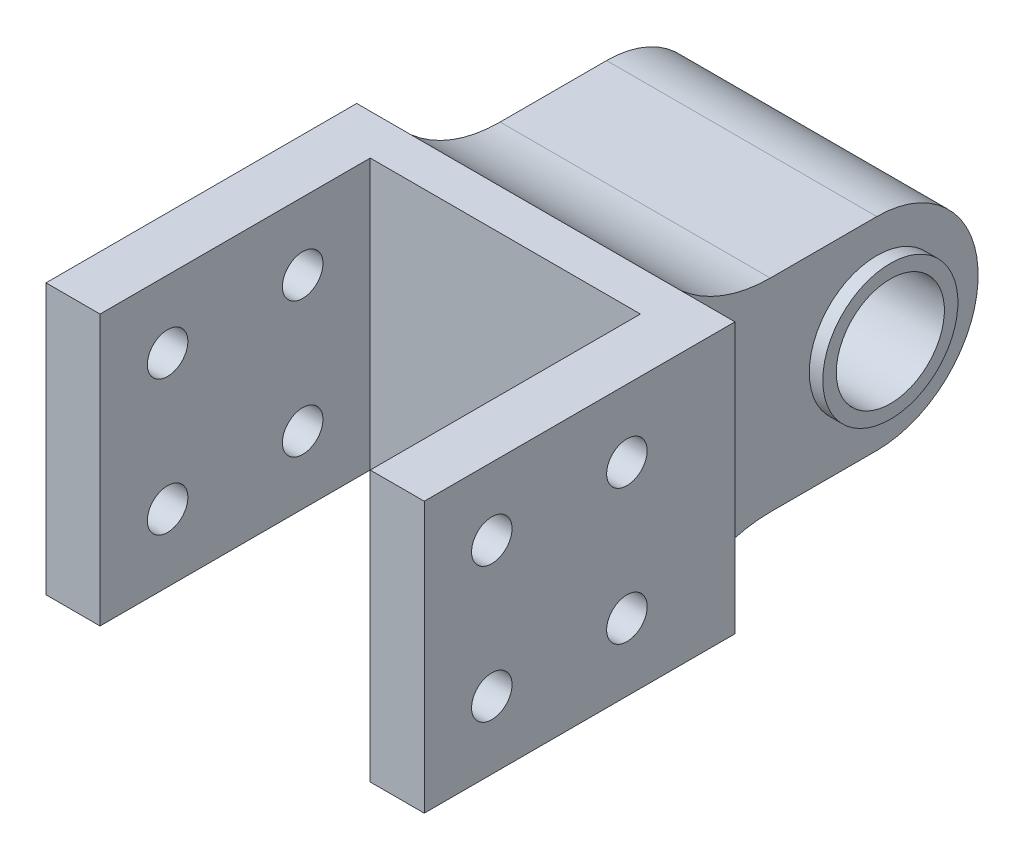
ISO-10303-21;
HEADER;
FILE_DESCRIPTION(('STEP AP214'),'2;1');
FILE_NAME('part.step','',(''),(''),'','','');
FILE_SCHEMA(('AUTOMOTIVE_DESIGN { 1 0 10303 214 1 1 1 1 }'));
ENDSEC;
DATA;
#1=APPLICATION_CONTEXT('core data for automotive mechanical design processes');
#2=APPLICATION_PROTOCOL_DEFINITION('international standard','automotive_design',2000,#1);
#3=PRODUCT_CONTEXT('',#1,'mechanical');
#4=PRODUCT('Part','Part','',(#3));
#5=PRODUCT_RELATED_PRODUCT_CATEGORY('part','',(#4));
#6=PRODUCT_DEFINITION_FORMATION('','',#4);
#7=PRODUCT_DEFINITION_CONTEXT('part definition',#1,'design');
#8=PRODUCT_DEFINITION('design','',#6,#7);
#9=PRODUCT_DEFINITION_SHAPE('','',#8);
#10=(LENGTH_UNIT() NAMED_UNIT(*) SI_UNIT(.MILLI.,.METRE.));
#11=(NAMED_UNIT(*) PLANE_ANGLE_UNIT() SI_UNIT($,.RADIAN.));
#12=(NAMED_UNIT(*) SI_UNIT($,.STERADIAN.) SOLID_ANGLE_UNIT());
#13=UNCERTAINTY_MEASURE_WITH_UNIT(LENGTH_MEASURE(1.E-05),#10,'distance_accuracy_value','');
#14=(GEOMETRIC_REPRESENTATION_CONTEXT(3) GLOBAL_UNCERTAINTY_ASSIGNED_CONTEXT((#13)) GLOBAL_UNIT_ASSIGNED_CONTEXT((#10,
#11,#12)) REPRESENTATION_CONTEXT('',''));
#15=CARTESIAN_POINT('',(0.,0.,0.));
#16=DIRECTION('',(0.,0.,1.));
#17=DIRECTION('',(1.,0.,0.));
#18=AXIS2_PLACEMENT_3D('',#15,#16,#17);
#19=CARTESIAN_POINT('',(0.,0.,20.));
#20=DIRECTION('',(0.,0.,-1.));
#21=DIRECTION('',(-1.,0.,0.));
#22=AXIS2_PLACEMENT_3D('',#19,#20,#21);
#23=PLANE('',#22);
#24=DIRECTION('',(1.,0.,0.));
#25=VECTOR('',#24,1.);
#26=CARTESIAN_POINT('',(-14.,-10.,20.));
#27=LINE('',#26,#25);
#28=CARTESIAN_POINT('',(-14.,-10.,20.));
#29=VERTEX_POINT('',#28);
#30=CARTESIAN_POINT('',(-10.,-10.,20.));
#31=VERTEX_POINT('',#30);
#32=EDGE_CURVE('E239',#29,#31,#27,.T.);
#33=ORIENTED_EDGE('',*,*,#32,.T.);
#34=DIRECTION('',(0.,-1.,0.));
#35=VECTOR('',#34,1.);
#36=CARTESIAN_POINT('',(-10.,10.,20.));
#37=LINE('',#36,#35);
#38=CARTESIAN_POINT('',(-10.,10.,20.));
#39=VERTEX_POINT('',#38);
#40=EDGE_CURVE('E173',#39,#31,#37,.T.);
#41=ORIENTED_EDGE('',*,*,#40,.F.);
#42=DIRECTION('',(-1.,0.,0.));
#43=VECTOR('',#42,1.);
#44=CARTESIAN_POINT('',(-14.,10.,20.));
#45=LINE('',#44,#43);
#46=CARTESIAN_POINT('',(-14.,10.,20.));
#47=VERTEX_POINT('',#46);
#48=EDGE_CURVE('E162',#39,#47,#45,.T.);
#49=ORIENTED_EDGE('',*,*,#48,.T.);
#50=DIRECTION('',(0.,-1.,0.));
#51=VECTOR('',#50,1.);
#52=CARTESIAN_POINT('',(-14.,-10.,20.));
#53=LINE('',#52,#51);
#54=EDGE_CURVE('E236',#47,#29,#53,.T.);
#55=ORIENTED_EDGE('',*,*,#54,.T.);
#56=EDGE_LOOP('',(#33,#41,#49,#55));
#57=FACE_BOUND('',#56,.T.);
#58=ADVANCED_FACE('F35',(#57),#23,.F.);
#59=CARTESIAN_POINT('',(0.,0.,-3.));
#60=DIRECTION('',(0.,0.,-1.));
#61=DIRECTION('',(-1.,0.,0.));
#62=AXIS2_PLACEMENT_3D('',#59,#60,#61);
#63=PLANE('',#62);
#64=DIRECTION('',(0.,-1.,0.));
#65=VECTOR('',#64,1.);
#66=CARTESIAN_POINT('',(-10.,7.5,-3.));
#67=LINE('',#66,#65);
#68=CARTESIAN_POINT('',(-9.99999999999091,9.99999999999091,-3.));
#69=VERTEX_POINT('',#68);
#70=CARTESIAN_POINT('',(-9.99999999999091,-9.99999999999091,-3.));
#71=VERTEX_POINT('',#70);
#72=EDGE_CURVE('E206',#69,#71,#67,.T.);
#73=ORIENTED_EDGE('',*,*,#72,.T.);
#74=DIRECTION('',(-1.,0.,0.));
#75=VECTOR('',#74,1.);
#76=CARTESIAN_POINT('',(-400000.,-9.99999999999091,-3.));
#77=LINE('',#76,#75);
#78=CARTESIAN_POINT('',(-14.00000000001,-9.99999999999091,-3.));
#79=VERTEX_POINT('',#78);
#80=EDGE_CURVE('E214',#71,#79,#77,.T.);
#81=ORIENTED_EDGE('',*,*,#80,.T.);
#82=DIRECTION('',(0.,1.,0.));
#83=VECTOR('',#82,1.);
#84=CARTESIAN_POINT('',(-14.00000000001,-291588.999945,-3.));
#85=LINE('',#84,#83);
#86=CARTESIAN_POINT('',(-14.00000000001,9.99999999999091,-3.));
#87=VERTEX_POINT('',#86);
#88=EDGE_CURVE('E218',#79,#87,#85,.T.);
#89=ORIENTED_EDGE('',*,*,#88,.T.);
#90=DIRECTION('',(1.,0.,0.));
#91=VECTOR('',#90,1.);
#92=CARTESIAN_POINT('',(-400000.,9.99999999999091,-3.));
#93=LINE('',#92,#91);
#94=EDGE_CURVE('E223',#87,#69,#93,.T.);
#95=ORIENTED_EDGE('',*,*,#94,.T.);
#96=EDGE_LOOP('',(#73,#81,#89,#95));
#97=FACE_BOUND('',#96,.T.);
#98=ADVANCED_FACE('F328',(#97),#63,.T.);
#99=CARTESIAN_POINT('',(-10.,0.,-17.5));
#100=DIRECTION('',(1.,0.,0.));
#101=DIRECTION('',(0.,0.,-1.));
#102=AXIS2_PLACEMENT_3D('',#99,#100,#101);
#103=PLANE('',#102);
#104=CARTESIAN_POINT('',(-10.,0.,-17.5));
#105=DIRECTION('',(1.,0.,0.));
#106=DIRECTION('',(0.,0.,-1.));
#107=AXIS2_PLACEMENT_3D('',#104,#105,#106);
#108=CIRCLE('',#107,7.5);
#109=CARTESIAN_POINT('',(-10.,-7.5,-17.5));
#110=VERTEX_POINT('',#109);
#111=CARTESIAN_POINT('',(-10.,7.5,-17.5));
#112=VERTEX_POINT('',#111);
#113=EDGE_CURVE('E190',#110,#112,#108,.T.);
#114=ORIENTED_EDGE('',*,*,#113,.F.);
#115=DIRECTION('',(0.,0.,-1.));
#116=VECTOR('',#115,1.);
#117=CARTESIAN_POINT('',(-10.,-7.5,-3.));
#118=LINE('',#117,#116);
#119=CARTESIAN_POINT('',(-10.,-7.5,-9.61437827766148));
#120=VERTEX_POINT('',#119);
#121=EDGE_CURVE('E195',#120,#110,#118,.T.);
#122=ORIENTED_EDGE('',*,*,#121,.F.);
#123=CARTESIAN_POINT('',(-10.,-17.5,-9.61437827766148));
#124=DIRECTION('',(1.,0.,0.));
#125=DIRECTION('',(0.,0.,-1.));
#126=AXIS2_PLACEMENT_3D('',#123,#124,#125);
#127=CIRCLE('',#126,10.);
#128=EDGE_CURVE('E262',#120,#71,#127,.T.);
#129=ORIENTED_EDGE('',*,*,#128,.T.);
#130=ORIENTED_EDGE('',*,*,#72,.F.);
#131=CARTESIAN_POINT('',(-10.,17.5,-9.61437827766147));
#132=DIRECTION('',(1.,0.,0.));
#133=DIRECTION('',(0.,0.,-1.));
#134=AXIS2_PLACEMENT_3D('',#131,#132,#133);
#135=CIRCLE('',#134,10.);
#136=CARTESIAN_POINT('',(-10.,7.5,-9.61437827766148));
#137=VERTEX_POINT('',#136);
#138=EDGE_CURVE('E44',#69,#137,#135,.T.);
#139=ORIENTED_EDGE('',*,*,#138,.T.);
#140=DIRECTION('',(0.,0.,1.));
#141=VECTOR('',#140,1.);
#142=CARTESIAN_POINT('',(-10.,7.5,-17.5));
#143=LINE('',#142,#141);
#144=EDGE_CURVE('E204',#112,#137,#143,.T.);
#145=ORIENTED_EDGE('',*,*,#144,.F.);
#146=EDGE_LOOP('',(#114,#122,#129,#130,#139,#145));
#147=FACE_BOUND('',#146,.T.);
#148=CARTESIAN_POINT('',(-10.,0.,-17.5));
#149=DIRECTION('',(1.,0.,0.));
#150=DIRECTION('',(0.,0.,-1.));
#151=AXIS2_PLACEMENT_3D('',#148,#149,#150);
#152=CIRCLE('',#151,5.);
#153=CARTESIAN_POINT('',(-10.,0.,-22.5));
#154=VERTEX_POINT('',#153);
#155=EDGE_CURVE('E252',#154,#154,#152,.F.);
#156=ORIENTED_EDGE('',*,*,#155,.F.);
#157=EDGE_LOOP('',(#156));
#158=FACE_BOUND('',#157,.T.);
#159=ADVANCED_FACE('F335',(#147,#158),#103,.F.);
#160=CARTESIAN_POINT('',(14.00000000001,-9.99999999999091,-3.));
#161=VERTEX_POINT('',#160);
#162=CARTESIAN_POINT('',(9.99999999999091,-9.99999999999091,-3.));
#163=VERTEX_POINT('',#162);
#164=EDGE_CURVE('E215',#161,#163,#77,.T.);
#165=ORIENTED_EDGE('',*,*,#164,.T.);
#166=DIRECTION('',(0.,-1.,0.));
#167=VECTOR('',#166,1.);
#168=CARTESIAN_POINT('',(10.,7.5,-3.));
#169=LINE('',#168,#167);
#170=CARTESIAN_POINT('',(9.99999999999091,9.99999999999091,-3.));
#171=VERTEX_POINT('',#170);
#172=EDGE_CURVE('E197',#171,#163,#169,.T.);
#173=ORIENTED_EDGE('',*,*,#172,.F.);
#174=CARTESIAN_POINT('',(14.00000000001,9.99999999999091,-3.));
#175=VERTEX_POINT('',#174);
#176=EDGE_CURVE('E222',#171,#175,#93,.T.);
#177=ORIENTED_EDGE('',*,*,#176,.T.);
#178=DIRECTION('',(0.,-1.,0.));
#179=VECTOR('',#178,1.);
#180=CARTESIAN_POINT('',(14.00000000001,-291588.999945,-3.));
#181=LINE('',#180,#179);
#182=EDGE_CURVE('E226',#175,#161,#181,.T.);
#183=ORIENTED_EDGE('',*,*,#182,.T.);
#184=EDGE_LOOP('',(#165,#173,#177,#183));
#185=FACE_BOUND('',#184,.T.);
#186=ADVANCED_FACE('F338',(#185),#63,.T.);
#187=CARTESIAN_POINT('',(14.,-10.,20.));
#188=DIRECTION('',(-1.,0.,0.));
#189=DIRECTION('',(0.,0.,1.));
#190=AXIS2_PLACEMENT_3D('',#187,#188,#189);
#191=PLANE('',#190);
#192=CARTESIAN_POINT('',(14.,-4.9999999999957,15.));
#193=DIRECTION('',(1.,0.,0.));
#194=DIRECTION('',(0.,0.,-1.));
#195=AXIS2_PLACEMENT_3D('',#192,#193,#194);
#196=CIRCLE('',#195,1.5);
#197=CARTESIAN_POINT('',(14.,-4.9999999999957,13.5));
#198=VERTEX_POINT('',#197);
#199=EDGE_CURVE('E530',#198,#198,#196,.T.);
#200=ORIENTED_EDGE('',*,*,#199,.F.);
#201=EDGE_LOOP('',(#200));
#202=FACE_BOUND('',#201,.T.);
#203=CARTESIAN_POINT('',(14.,-4.9999999999957,5.));
#204=DIRECTION('',(1.,0.,0.));
#205=DIRECTION('',(0.,0.,-1.));
#206=AXIS2_PLACEMENT_3D('',#203,#204,#205);
#207=CIRCLE('',#206,1.5);
#208=CARTESIAN_POINT('',(14.,-4.9999999999957,3.5));
#209=VERTEX_POINT('',#208);
#210=EDGE_CURVE('E532',#209,#209,#207,.T.);
#211=ORIENTED_EDGE('',*,*,#210,.F.);
#212=EDGE_LOOP('',(#211));
#213=FACE_BOUND('',#212,.T.);
#214=CARTESIAN_POINT('',(14.,5.0000000000043,5.));
#215=DIRECTION('',(1.,0.,0.));
#216=DIRECTION('',(0.,0.,-1.));
#217=AXIS2_PLACEMENT_3D('',#214,#215,#216);
#218=CIRCLE('',#217,1.5);
#219=CARTESIAN_POINT('',(14.,5.0000000000043,3.5));
#220=VERTEX_POINT('',#219);
#221=EDGE_CURVE('E529',#220,#220,#218,.T.);
#222=ORIENTED_EDGE('',*,*,#221,.F.);
#223=EDGE_LOOP('',(#222));
#224=FACE_BOUND('',#223,.T.);
#225=CARTESIAN_POINT('',(14.,5.0000000000043,15.));
#226=DIRECTION('',(1.,0.,0.));
#227=DIRECTION('',(0.,0.,-1.));
#228=AXIS2_PLACEMENT_3D('',#225,#226,#227);
#229=CIRCLE('',#228,1.5);
#230=CARTESIAN_POINT('',(14.,5.0000000000043,13.5));
#231=VERTEX_POINT('',#230);
#232=EDGE_CURVE('E272',#231,#231,#229,.T.);
#233=ORIENTED_EDGE('',*,*,#232,.F.);
#234=EDGE_LOOP('',(#233));
#235=FACE_BOUND('',#234,.T.);
#236=DIRECTION('',(0.,0.,-1.));
#237=VECTOR('',#236,1.);
#238=CARTESIAN_POINT('',(14.,-10.,20.));
#239=LINE('',#238,#237);
#240=CARTESIAN_POINT('',(14.,-10.,20.));
#241=VERTEX_POINT('',#240);
#242=EDGE_CURVE('E242',#241,#161,#239,.T.);
#243=ORIENTED_EDGE('',*,*,#242,.T.);
#244=ORIENTED_EDGE('',*,*,#182,.F.);
#245=DIRECTION('',(0.,0.,-1.));
#246=VECTOR('',#245,1.);
#247=CARTESIAN_POINT('',(14.,10.,20.));
#248=LINE('',#247,#246);
#249=CARTESIAN_POINT('',(14.,10.,20.));
#250=VERTEX_POINT('',#249);
#251=EDGE_CURVE('E249',#250,#175,#248,.T.);
#252=ORIENTED_EDGE('',*,*,#251,.F.);
#253=DIRECTION('',(0.,1.,0.));
#254=VECTOR('',#253,1.);
#255=CARTESIAN_POINT('',(14.,-10.,20.));
#256=LINE('',#255,#254);
#257=EDGE_CURVE('E230',#241,#250,#256,.T.);
#258=ORIENTED_EDGE('',*,*,#257,.F.);
#259=EDGE_LOOP('',(#243,#244,#252,#258));
#260=FACE_BOUND('',#259,.T.);
#261=ADVANCED_FACE('F362',(#202,#213,#224,#235,#260),#191,.F.);
#262=CARTESIAN_POINT('',(-14.,10.,20.));
#263=DIRECTION('',(0.,-1.,0.));
#264=DIRECTION('',(0.,0.,-1.));
#265=AXIS2_PLACEMENT_3D('',#262,#263,#264);
#266=PLANE('',#265);
#267=ORIENTED_EDGE('',*,*,#48,.F.);
#268=DIRECTION('',(0.,0.,-1.));
#269=VECTOR('',#268,1.);
#270=CARTESIAN_POINT('',(-10.,10.,20.));
#271=LINE('',#270,#269);
#272=CARTESIAN_POINT('',(-10.,10.,0.));
#273=VERTEX_POINT('',#272);
#274=EDGE_CURVE('E142',#39,#273,#271,.T.);
#275=ORIENTED_EDGE('',*,*,#274,.T.);
#276=DIRECTION('',(1.,0.,0.));
#277=VECTOR('',#276,1.);
#278=CARTESIAN_POINT('',(-10.,10.,0.));
#279=LINE('',#278,#277);
#280=CARTESIAN_POINT('',(10.,10.,0.));
#281=VERTEX_POINT('',#280);
#282=EDGE_CURVE('E153',#273,#281,#279,.T.);
#283=ORIENTED_EDGE('',*,*,#282,.T.);
#284=DIRECTION('',(0.,0.,1.));
#285=VECTOR('',#284,1.);
#286=CARTESIAN_POINT('',(10.,10.,20.));
#287=LINE('',#286,#285);
#288=CARTESIAN_POINT('',(10.,10.,20.));
#289=VERTEX_POINT('',#288);
#290=EDGE_CURVE('E150',#281,#289,#287,.T.);
#291=ORIENTED_EDGE('',*,*,#290,.T.);
#292=EDGE_CURVE('E233',#250,#289,#45,.T.);
#293=ORIENTED_EDGE('',*,*,#292,.F.);
#294=ORIENTED_EDGE('',*,*,#251,.T.);
#295=ORIENTED_EDGE('',*,*,#176,.F.);
#296=EDGE_CURVE('E227',#69,#171,#93,.T.);
#297=ORIENTED_EDGE('',*,*,#296,.F.);
#298=ORIENTED_EDGE('',*,*,#94,.F.);
#299=DIRECTION('',(0.,0.,-1.));
#300=VECTOR('',#299,1.);
#301=CARTESIAN_POINT('',(-14.,10.,20.));
#302=LINE('',#301,#300);
#303=EDGE_CURVE('E247',#47,#87,#302,.T.);
#304=ORIENTED_EDGE('',*,*,#303,.F.);
#305=EDGE_LOOP('',(#267,#275,#283,#291,#293,#294,#295,#297,#298,#304));
#306=FACE_BOUND('',#305,.T.);
#307=ADVANCED_FACE('F160',(#306),#266,.F.);
#308=CARTESIAN_POINT('',(-14.,-10.,20.));
#309=DIRECTION('',(1.,0.,0.));
#310=DIRECTION('',(0.,0.,-1.));
#311=AXIS2_PLACEMENT_3D('',#308,#309,#310);
#312=PLANE('',#311);
#313=CARTESIAN_POINT('',(-14.,-4.9999999999957,15.));
#314=DIRECTION('',(1.,0.,0.));
#315=DIRECTION('',(0.,0.,-1.));
#316=AXIS2_PLACEMENT_3D('',#313,#314,#315);
#317=CIRCLE('',#316,1.5);
#318=CARTESIAN_POINT('',(-14.,-4.9999999999957,13.5));
#319=VERTEX_POINT('',#318);
#320=EDGE_CURVE('E167',#319,#319,#317,.T.);
#321=ORIENTED_EDGE('',*,*,#320,.T.);
#322=EDGE_LOOP('',(#321));
#323=FACE_BOUND('',#322,.T.);
#324=CARTESIAN_POINT('',(-14.,-4.9999999999957,5.));
#325=DIRECTION('',(1.,0.,0.));
#326=DIRECTION('',(0.,0.,-1.));
#327=AXIS2_PLACEMENT_3D('',#324,#325,#326);
#328=CIRCLE('',#327,1.5);
#329=CARTESIAN_POINT('',(-14.,-4.9999999999957,3.5));
#330=VERTEX_POINT('',#329);
#331=EDGE_CURVE('E284',#330,#330,#328,.T.);
#332=ORIENTED_EDGE('',*,*,#331,.T.);
#333=EDGE_LOOP('',(#332));
#334=FACE_BOUND('',#333,.T.);
#335=CARTESIAN_POINT('',(-14.,5.0000000000043,5.));
#336=DIRECTION('',(1.,0.,0.));
#337=DIRECTION('',(0.,0.,-1.));
#338=AXIS2_PLACEMENT_3D('',#335,#336,#337);
#339=CIRCLE('',#338,1.5);
#340=CARTESIAN_POINT('',(-14.,5.0000000000043,3.5));
#341=VERTEX_POINT('',#340);
#342=EDGE_CURVE('E280',#341,#341,#339,.T.);
#343=ORIENTED_EDGE('',*,*,#342,.T.);
#344=EDGE_LOOP('',(#343));
#345=FACE_BOUND('',#344,.T.);
#346=CARTESIAN_POINT('',(-14.,5.0000000000043,15.));
#347=DIRECTION('',(1.,0.,0.));
#348=DIRECTION('',(0.,0.,-1.));
#349=AXIS2_PLACEMENT_3D('',#346,#347,#348);
#350=CIRCLE('',#349,1.5);
#351=CARTESIAN_POINT('',(-14.,5.0000000000043,13.5));
#352=VERTEX_POINT('',#351);
#353=EDGE_CURVE('E276',#352,#352,#350,.T.);
#354=ORIENTED_EDGE('',*,*,#353,.T.);
#355=EDGE_LOOP('',(#354));
#356=FACE_BOUND('',#355,.T.);
#357=ORIENTED_EDGE('',*,*,#303,.T.);
#358=ORIENTED_EDGE('',*,*,#88,.F.);
#359=DIRECTION('',(0.,0.,-1.));
#360=VECTOR('',#359,1.);
#361=CARTESIAN_POINT('',(-14.,-10.,20.));
#362=LINE('',#361,#360);
#363=EDGE_CURVE('E244',#29,#79,#362,.T.);
#364=ORIENTED_EDGE('',*,*,#363,.F.);
#365=ORIENTED_EDGE('',*,*,#54,.F.);
#366=EDGE_LOOP('',(#357,#358,#364,#365));
#367=FACE_BOUND('',#366,.T.);
#368=ADVANCED_FACE('F351',(#323,#334,#345,#356,#367),#312,.F.);
#369=CARTESIAN_POINT('',(-14.,-10.,20.));
#370=DIRECTION('',(0.,1.,0.));
#371=DIRECTION('',(0.,0.,1.));
#372=AXIS2_PLACEMENT_3D('',#369,#370,#371);
#373=PLANE('',#372);
#374=DIRECTION('',(1.,0.,0.));
#375=VECTOR('',#374,1.);
#376=CARTESIAN_POINT('',(-10.,-10.,0.));
#377=LINE('',#376,#375);
#378=CARTESIAN_POINT('',(-10.,-10.,0.));
#379=VERTEX_POINT('',#378);
#380=CARTESIAN_POINT('',(10.,-10.,0.));
#381=VERTEX_POINT('',#380);
#382=EDGE_CURVE('E164',#379,#381,#377,.T.);
#383=ORIENTED_EDGE('',*,*,#382,.F.);
#384=DIRECTION('',(0.,0.,-1.));
#385=VECTOR('',#384,1.);
#386=CARTESIAN_POINT('',(-10.,-10.,20.));
#387=LINE('',#386,#385);
#388=EDGE_CURVE('E145',#31,#379,#387,.T.);
#389=ORIENTED_EDGE('',*,*,#388,.F.);
#390=ORIENTED_EDGE('',*,*,#32,.F.);
#391=ORIENTED_EDGE('',*,*,#363,.T.);
#392=ORIENTED_EDGE('',*,*,#80,.F.);
#393=EDGE_CURVE('E219',#163,#71,#77,.T.);
#394=ORIENTED_EDGE('',*,*,#393,.F.);
#395=ORIENTED_EDGE('',*,*,#164,.F.);
#396=ORIENTED_EDGE('',*,*,#242,.F.);
#397=CARTESIAN_POINT('',(10.,-10.,20.));
#398=VERTEX_POINT('',#397);
#399=EDGE_CURVE('E238',#398,#241,#27,.T.);
#400=ORIENTED_EDGE('',*,*,#399,.F.);
#401=DIRECTION('',(0.,0.,1.));
#402=VECTOR('',#401,1.);
#403=CARTESIAN_POINT('',(10.,-10.,20.));
#404=LINE('',#403,#402);
#405=EDGE_CURVE('E52',#381,#398,#404,.T.);
#406=ORIENTED_EDGE('',*,*,#405,.F.);
#407=EDGE_LOOP('',(#383,#389,#390,#391,#392,#394,#395,#396,#400,#406));
#408=FACE_BOUND('',#407,.T.);
#409=ADVANCED_FACE('F342',(#408),#373,.F.);
#410=ORIENTED_EDGE('',*,*,#292,.T.);
#411=DIRECTION('',(0.,-1.,0.));
#412=VECTOR('',#411,1.);
#413=CARTESIAN_POINT('',(10.,10.,20.));
#414=LINE('',#413,#412);
#415=EDGE_CURVE('E176',#289,#398,#414,.T.);
#416=ORIENTED_EDGE('',*,*,#415,.T.);
#417=ORIENTED_EDGE('',*,*,#399,.T.);
#418=ORIENTED_EDGE('',*,*,#257,.T.);
#419=EDGE_LOOP('',(#410,#416,#417,#418));
#420=FACE_BOUND('',#419,.T.);
#421=ADVANCED_FACE('F331',(#420),#23,.F.);
#422=CARTESIAN_POINT('',(10.,0.,-17.5));
#423=DIRECTION('',(1.,0.,0.));
#424=DIRECTION('',(0.,0.,-1.));
#425=AXIS2_PLACEMENT_3D('',#422,#423,#424);
#426=PLANE('',#425);
#427=CARTESIAN_POINT('',(10.,0.,-17.5));
#428=DIRECTION('',(1.,0.,0.));
#429=DIRECTION('',(0.,0.,-1.));
#430=AXIS2_PLACEMENT_3D('',#427,#428,#429);
#431=CIRCLE('',#430,5.);
#432=CARTESIAN_POINT('',(10.,0.,-22.5));
#433=VERTEX_POINT('',#432);
#434=EDGE_CURVE('E255',#433,#433,#431,.T.);
#435=ORIENTED_EDGE('',*,*,#434,.F.);
#436=EDGE_LOOP('',(#435));
#437=FACE_BOUND('',#436,.T.);
#438=CARTESIAN_POINT('',(10.,0.,-17.5));
#439=DIRECTION('',(1.,0.,0.));
#440=DIRECTION('',(0.,0.,-1.));
#441=AXIS2_PLACEMENT_3D('',#438,#439,#440);
#442=CIRCLE('',#441,7.5);
#443=CARTESIAN_POINT('',(10.,-7.5,-17.5));
#444=VERTEX_POINT('',#443);
#445=CARTESIAN_POINT('',(10.,7.5,-17.5));
#446=VERTEX_POINT('',#445);
#447=EDGE_CURVE('E191',#444,#446,#442,.T.);
#448=ORIENTED_EDGE('',*,*,#447,.T.);
#449=DIRECTION('',(0.,0.,1.));
#450=VECTOR('',#449,1.);
#451=CARTESIAN_POINT('',(10.,7.5,-17.5));
#452=LINE('',#451,#450);
#453=CARTESIAN_POINT('',(10.,7.5,-9.61437827766148));
#454=VERTEX_POINT('',#453);
#455=EDGE_CURVE('E194',#446,#454,#452,.T.);
#456=ORIENTED_EDGE('',*,*,#455,.T.);
#457=CARTESIAN_POINT('',(10.,17.5,-9.61437827766147));
#458=DIRECTION('',(1.,0.,0.));
#459=DIRECTION('',(0.,0.,-1.));
#460=AXIS2_PLACEMENT_3D('',#457,#458,#459);
#461=CIRCLE('',#460,10.);
#462=EDGE_CURVE('E11',#454,#171,#461,.F.);
#463=ORIENTED_EDGE('',*,*,#462,.T.);
#464=ORIENTED_EDGE('',*,*,#172,.T.);
#465=CARTESIAN_POINT('',(10.,-17.5,-9.61437827766148));
#466=DIRECTION('',(1.,0.,0.));
#467=DIRECTION('',(0.,0.,-1.));
#468=AXIS2_PLACEMENT_3D('',#465,#466,#467);
#469=CIRCLE('',#468,10.);
#470=CARTESIAN_POINT('',(10.,-7.5,-9.61437827766148));
#471=VERTEX_POINT('',#470);
#472=EDGE_CURVE('E265',#163,#471,#469,.F.);
#473=ORIENTED_EDGE('',*,*,#472,.T.);
#474=DIRECTION('',(0.,0.,-1.));
#475=VECTOR('',#474,1.);
#476=CARTESIAN_POINT('',(10.,-7.5,-3.));
#477=LINE('',#476,#475);
#478=EDGE_CURVE('E199',#471,#444,#477,.T.);
#479=ORIENTED_EDGE('',*,*,#478,.T.);
#480=EDGE_LOOP('',(#448,#456,#463,#464,#473,#479));
#481=FACE_BOUND('',#480,.T.);
#482=ADVANCED_FACE('F341',(#437,#481),#426,.T.);
#483=CARTESIAN_POINT('',(10.,0.,-17.5));
#484=DIRECTION('',(-1.,0.,0.));
#485=DIRECTION('',(0.,0.,1.));
#486=AXIS2_PLACEMENT_3D('',#483,#484,#485);
#487=CYLINDRICAL_SURFACE('',#486,7.5);
#488=ORIENTED_EDGE('',*,*,#113,.T.);
#489=DIRECTION('',(-1.,0.,0.));
#490=VECTOR('',#489,1.);
#491=CARTESIAN_POINT('',(10.,7.5,-17.5));
#492=LINE('',#491,#490);
#493=EDGE_CURVE('E211',#446,#112,#492,.T.);
#494=ORIENTED_EDGE('',*,*,#493,.F.);
#495=ORIENTED_EDGE('',*,*,#447,.F.);
#496=DIRECTION('',(-1.,0.,0.));
#497=VECTOR('',#496,1.);
#498=CARTESIAN_POINT('',(10.,-7.5,-17.5));
#499=LINE('',#498,#497);
#500=EDGE_CURVE('E201',#444,#110,#499,.T.);
#501=ORIENTED_EDGE('',*,*,#500,.T.);
#502=EDGE_LOOP('',(#488,#494,#495,#501));
#503=FACE_BOUND('',#502,.T.);
#504=ADVANCED_FACE('F348',(#503),#487,.T.);
#505=CARTESIAN_POINT('',(10.,7.5,-17.5));
#506=DIRECTION('',(0.,-1.,0.));
#507=DIRECTION('',(0.,0.,-1.));
#508=AXIS2_PLACEMENT_3D('',#505,#506,#507);
#509=PLANE('',#508);
#510=ORIENTED_EDGE('',*,*,#144,.T.);
#511=DIRECTION('',(-1.,0.,0.));
#512=VECTOR('',#511,1.);
#513=CARTESIAN_POINT('',(10.,7.5,-9.61437827766148));
#514=LINE('',#513,#512);
#515=EDGE_CURVE('E60',#137,#454,#514,.F.);
#516=ORIENTED_EDGE('',*,*,#515,.T.);
#517=ORIENTED_EDGE('',*,*,#455,.F.);
#518=ORIENTED_EDGE('',*,*,#493,.T.);
#519=EDGE_LOOP('',(#510,#516,#517,#518));
#520=FACE_BOUND('',#519,.T.);
#521=ADVANCED_FACE('F391',(#520),#509,.F.);
#522=CARTESIAN_POINT('',(10.,-7.5,-3.));
#523=DIRECTION('',(0.,1.,0.));
#524=DIRECTION('',(0.,0.,1.));
#525=AXIS2_PLACEMENT_3D('',#522,#523,#524);
#526=PLANE('',#525);
#527=ORIENTED_EDGE('',*,*,#478,.F.);
#528=DIRECTION('',(1.,0.,0.));
#529=VECTOR('',#528,1.);
#530=CARTESIAN_POINT('',(10.,-7.5,-9.61437827766148));
#531=LINE('',#530,#529);
#532=EDGE_CURVE('E258',#471,#120,#531,.F.);
#533=ORIENTED_EDGE('',*,*,#532,.T.);
#534=ORIENTED_EDGE('',*,*,#121,.T.);
#535=ORIENTED_EDGE('',*,*,#500,.F.);
#536=EDGE_LOOP('',(#527,#533,#534,#535));
#537=FACE_BOUND('',#536,.T.);
#538=ADVANCED_FACE('F385',(#537),#526,.F.);
#539=CARTESIAN_POINT('',(10.,0.,-17.5));
#540=DIRECTION('',(-1.,0.,0.));
#541=DIRECTION('',(0.,0.,1.));
#542=AXIS2_PLACEMENT_3D('',#539,#540,#541);
#543=CYLINDRICAL_SURFACE('',#542,4.);
#544=CARTESIAN_POINT('',(-11.,0.,-17.5));
#545=DIRECTION('',(-1.,0.,0.));
#546=DIRECTION('',(0.,0.,1.));
#547=AXIS2_PLACEMENT_3D('',#544,#545,#546);
#548=CIRCLE('',#547,4.);
#549=CARTESIAN_POINT('',(-11.,0.,-13.5));
#550=VERTEX_POINT('',#549);
#551=EDGE_CURVE('E184',#550,#550,#548,.T.);
#552=ORIENTED_EDGE('',*,*,#551,.T.);
#553=EDGE_LOOP('',(#552));
#554=FACE_BOUND('',#553,.T.);
#555=CARTESIAN_POINT('',(11.,0.,-17.5));
#556=DIRECTION('',(-1.,0.,0.));
#557=DIRECTION('',(0.,0.,1.));
#558=AXIS2_PLACEMENT_3D('',#555,#556,#557);
#559=CIRCLE('',#558,4.);
#560=CARTESIAN_POINT('',(11.,0.,-13.5));
#561=VERTEX_POINT('',#560);
#562=EDGE_CURVE('E175',#561,#561,#559,.T.);
#563=ORIENTED_EDGE('',*,*,#562,.F.);
#564=EDGE_LOOP('',(#563));
#565=FACE_BOUND('',#564,.T.);
#566=ADVANCED_FACE('F411',(#554,#565),#543,.F.);
#567=CARTESIAN_POINT('',(-11.,0.,-17.5));
#568=DIRECTION('',(-1.,0.,0.));
#569=DIRECTION('',(0.,0.,1.));
#570=AXIS2_PLACEMENT_3D('',#567,#568,#569);
#571=PLANE('',#570);
#572=CARTESIAN_POINT('',(-11.,0.,-17.5));
#573=DIRECTION('',(-1.,0.,0.));
#574=DIRECTION('',(0.,0.,1.));
#575=AXIS2_PLACEMENT_3D('',#572,#573,#574);
#576=CIRCLE('',#575,5.);
#577=CARTESIAN_POINT('',(-11.,0.,-12.5));
#578=VERTEX_POINT('',#577);
#579=EDGE_CURVE('E187',#578,#578,#576,.T.);
#580=ORIENTED_EDGE('',*,*,#579,.T.);
#581=EDGE_LOOP('',(#580));
#582=FACE_BOUND('',#581,.T.);
#583=ORIENTED_EDGE('',*,*,#551,.F.);
#584=EDGE_LOOP('',(#583));
#585=FACE_BOUND('',#584,.T.);
#586=ADVANCED_FACE('F401',(#582,#585),#571,.T.);
#587=CARTESIAN_POINT('',(-11.,0.,-17.5));
#588=DIRECTION('',(1.,0.,0.));
#589=DIRECTION('',(0.,0.,-1.));
#590=AXIS2_PLACEMENT_3D('',#587,#588,#589);
#591=CYLINDRICAL_SURFACE('',#590,5.);
#592=ORIENTED_EDGE('',*,*,#579,.F.);
#593=EDGE_LOOP('',(#592));
#594=FACE_BOUND('',#593,.T.);
#595=ORIENTED_EDGE('',*,*,#155,.T.);
#596=EDGE_LOOP('',(#595));
#597=FACE_BOUND('',#596,.T.);
#598=ADVANCED_FACE('F398',(#594,#597),#591,.T.);
#599=CARTESIAN_POINT('',(11.,0.,-17.5));
#600=DIRECTION('',(-1.,0.,0.));
#601=DIRECTION('',(0.,0.,1.));
#602=AXIS2_PLACEMENT_3D('',#599,#600,#601);
#603=CYLINDRICAL_SURFACE('',#602,5.);
#604=CARTESIAN_POINT('',(11.,0.,-17.5));
#605=DIRECTION('',(-1.,0.,0.));
#606=DIRECTION('',(0.,0.,1.));
#607=AXIS2_PLACEMENT_3D('',#604,#605,#606);
#608=CIRCLE('',#607,5.);
#609=CARTESIAN_POINT('',(11.,0.,-12.5));
#610=VERTEX_POINT('',#609);
#611=EDGE_CURVE('E181',#610,#610,#608,.T.);
#612=ORIENTED_EDGE('',*,*,#611,.T.);
#613=EDGE_LOOP('',(#612));
#614=FACE_BOUND('',#613,.T.);
#615=ORIENTED_EDGE('',*,*,#434,.T.);
#616=EDGE_LOOP('',(#615));
#617=FACE_BOUND('',#616,.T.);
#618=ADVANCED_FACE('F400',(#614,#617),#603,.T.);
#619=CARTESIAN_POINT('',(11.,0.,-17.5));
#620=DIRECTION('',(1.,0.,0.));
#621=DIRECTION('',(0.,0.,1.));
#622=AXIS2_PLACEMENT_3D('',#619,#620,#621);
#623=PLANE('',#622);
#624=ORIENTED_EDGE('',*,*,#562,.T.);
#625=EDGE_LOOP('',(#624));
#626=FACE_BOUND('',#625,.T.);
#627=ORIENTED_EDGE('',*,*,#611,.F.);
#628=EDGE_LOOP('',(#627));
#629=FACE_BOUND('',#628,.T.);
#630=ADVANCED_FACE('F408',(#626,#629),#623,.T.);
#631=CARTESIAN_POINT('',(0.,-17.5,-9.61437827766148));
#632=DIRECTION('',(1.,0.,0.));
#633=DIRECTION('',(0.,0.,-1.));
#634=AXIS2_PLACEMENT_3D('',#631,#632,#633);
#635=CYLINDRICAL_SURFACE('',#634,10.);
#636=ORIENTED_EDGE('',*,*,#472,.F.);
#637=ORIENTED_EDGE('',*,*,#393,.T.);
#638=ORIENTED_EDGE('',*,*,#128,.F.);
#639=ORIENTED_EDGE('',*,*,#532,.F.);
#640=EDGE_LOOP('',(#636,#637,#638,#639));
#641=FACE_BOUND('',#640,.T.);
#642=ADVANCED_FACE('F379',(#641),#635,.F.);
#643=CARTESIAN_POINT('',(0.,17.5,-9.61437827766147));
#644=DIRECTION('',(-1.,0.,0.));
#645=DIRECTION('',(0.,0.,1.));
#646=AXIS2_PLACEMENT_3D('',#643,#644,#645);
#647=CYLINDRICAL_SURFACE('',#646,10.);
#648=ORIENTED_EDGE('',*,*,#462,.F.);
#649=ORIENTED_EDGE('',*,*,#515,.F.);
#650=ORIENTED_EDGE('',*,*,#138,.F.);
#651=ORIENTED_EDGE('',*,*,#296,.T.);
#652=EDGE_LOOP('',(#648,#649,#650,#651));
#653=FACE_BOUND('',#652,.T.);
#654=ADVANCED_FACE('F37',(#653),#647,.F.);
#655=CARTESIAN_POINT('',(-10.,10.,20.));
#656=DIRECTION('',(-1.,0.,0.));
#657=DIRECTION('',(0.,0.,1.));
#658=AXIS2_PLACEMENT_3D('',#655,#656,#657);
#659=PLANE('',#658);
#660=CARTESIAN_POINT('',(-10.,-4.9999999999957,15.));
#661=DIRECTION('',(-1.,0.,0.));
#662=DIRECTION('',(0.,0.,1.));
#663=AXIS2_PLACEMENT_3D('',#660,#661,#662);
#664=CIRCLE('',#663,1.5);
#665=CARTESIAN_POINT('',(-10.,-4.9999999999957,16.5));
#666=VERTEX_POINT('',#665);
#667=EDGE_CURVE('E295',#666,#666,#664,.T.);
#668=ORIENTED_EDGE('',*,*,#667,.T.);
#669=EDGE_LOOP('',(#668));
#670=FACE_BOUND('',#669,.T.);
#671=CARTESIAN_POINT('',(-10.,-4.9999999999957,5.));
#672=DIRECTION('',(-1.,0.,0.));
#673=DIRECTION('',(0.,0.,1.));
#674=AXIS2_PLACEMENT_3D('',#671,#672,#673);
#675=CIRCLE('',#674,1.5);
#676=CARTESIAN_POINT('',(-10.,-4.9999999999957,6.5));
#677=VERTEX_POINT('',#676);
#678=EDGE_CURVE('E279',#677,#677,#675,.T.);
#679=ORIENTED_EDGE('',*,*,#678,.T.);
#680=EDGE_LOOP('',(#679));
#681=FACE_BOUND('',#680,.T.);
#682=CARTESIAN_POINT('',(-10.,5.0000000000043,5.));
#683=DIRECTION('',(-1.,0.,0.));
#684=DIRECTION('',(0.,0.,1.));
#685=AXIS2_PLACEMENT_3D('',#682,#683,#684);
#686=CIRCLE('',#685,1.5);
#687=CARTESIAN_POINT('',(-10.,5.0000000000043,6.5));
#688=VERTEX_POINT('',#687);
#689=EDGE_CURVE('E275',#688,#688,#686,.T.);
#690=ORIENTED_EDGE('',*,*,#689,.T.);
#691=EDGE_LOOP('',(#690));
#692=FACE_BOUND('',#691,.T.);
#693=CARTESIAN_POINT('',(-10.,5.0000000000043,15.));
#694=DIRECTION('',(-1.,0.,0.));
#695=DIRECTION('',(0.,0.,1.));
#696=AXIS2_PLACEMENT_3D('',#693,#694,#695);
#697=CIRCLE('',#696,1.5);
#698=CARTESIAN_POINT('',(-10.,5.0000000000043,16.5));
#699=VERTEX_POINT('',#698);
#700=EDGE_CURVE('E271',#699,#699,#697,.T.);
#701=ORIENTED_EDGE('',*,*,#700,.T.);
#702=EDGE_LOOP('',(#701));
#703=FACE_BOUND('',#702,.T.);
#704=ORIENTED_EDGE('',*,*,#388,.T.);
#705=DIRECTION('',(0.,-1.,0.));
#706=VECTOR('',#705,1.);
#707=CARTESIAN_POINT('',(-10.,10.,0.));
#708=LINE('',#707,#706);
#709=EDGE_CURVE('E138',#273,#379,#708,.T.);
#710=ORIENTED_EDGE('',*,*,#709,.F.);
#711=ORIENTED_EDGE('',*,*,#274,.F.);
#712=ORIENTED_EDGE('',*,*,#40,.T.);
#713=EDGE_LOOP('',(#704,#710,#711,#712));
#714=FACE_BOUND('',#713,.T.);
#715=ADVANCED_FACE('F140',(#670,#681,#692,#703,#714),#659,.F.);
#716=CARTESIAN_POINT('',(10.,10.,20.));
#717=DIRECTION('',(1.,0.,0.));
#718=DIRECTION('',(0.,0.,-1.));
#719=AXIS2_PLACEMENT_3D('',#716,#717,#718);
#720=PLANE('',#719);
#721=CARTESIAN_POINT('',(10.,-4.9999999999957,15.));
#722=DIRECTION('',(1.,0.,0.));
#723=DIRECTION('',(0.,0.,-1.));
#724=AXIS2_PLACEMENT_3D('',#721,#722,#723);
#725=CIRCLE('',#724,1.5);
#726=CARTESIAN_POINT('',(10.,-4.9999999999957,13.5));
#727=VERTEX_POINT('',#726);
#728=EDGE_CURVE('E39',#727,#727,#725,.T.);
#729=ORIENTED_EDGE('',*,*,#728,.T.);
#730=EDGE_LOOP('',(#729));
#731=FACE_BOUND('',#730,.T.);
#732=CARTESIAN_POINT('',(10.,-4.9999999999957,5.));
#733=DIRECTION('',(1.,0.,0.));
#734=DIRECTION('',(0.,0.,-1.));
#735=AXIS2_PLACEMENT_3D('',#732,#733,#734);
#736=CIRCLE('',#735,1.5);
#737=CARTESIAN_POINT('',(10.,-4.9999999999957,3.5));
#738=VERTEX_POINT('',#737);
#739=EDGE_CURVE('E277',#738,#738,#736,.T.);
#740=ORIENTED_EDGE('',*,*,#739,.T.);
#741=EDGE_LOOP('',(#740));
#742=FACE_BOUND('',#741,.T.);
#743=CARTESIAN_POINT('',(10.,5.0000000000043,5.));
#744=DIRECTION('',(1.,0.,0.));
#745=DIRECTION('',(0.,0.,-1.));
#746=AXIS2_PLACEMENT_3D('',#743,#744,#745);
#747=CIRCLE('',#746,1.5);
#748=CARTESIAN_POINT('',(10.,5.0000000000043,3.5));
#749=VERTEX_POINT('',#748);
#750=EDGE_CURVE('E273',#749,#749,#747,.T.);
#751=ORIENTED_EDGE('',*,*,#750,.T.);
#752=EDGE_LOOP('',(#751));
#753=FACE_BOUND('',#752,.T.);
#754=CARTESIAN_POINT('',(10.,5.0000000000043,15.));
#755=DIRECTION('',(1.,0.,0.));
#756=DIRECTION('',(0.,0.,-1.));
#757=AXIS2_PLACEMENT_3D('',#754,#755,#756);
#758=CIRCLE('',#757,1.5);
#759=CARTESIAN_POINT('',(10.,5.0000000000043,13.5));
#760=VERTEX_POINT('',#759);
#761=EDGE_CURVE('E268',#760,#760,#758,.T.);
#762=ORIENTED_EDGE('',*,*,#761,.T.);
#763=EDGE_LOOP('',(#762));
#764=FACE_BOUND('',#763,.T.);
#765=ORIENTED_EDGE('',*,*,#405,.T.);
#766=ORIENTED_EDGE('',*,*,#415,.F.);
#767=ORIENTED_EDGE('',*,*,#290,.F.);
#768=DIRECTION('',(0.,-1.,0.));
#769=VECTOR('',#768,1.);
#770=CARTESIAN_POINT('',(10.,10.,0.));
#771=LINE('',#770,#769);
#772=EDGE_CURVE('E149',#281,#381,#771,.T.);
#773=ORIENTED_EDGE('',*,*,#772,.T.);
#774=EDGE_LOOP('',(#765,#766,#767,#773));
#775=FACE_BOUND('',#774,.T.);
#776=ADVANCED_FACE('F303',(#731,#742,#753,#764,#775),#720,.F.);
#777=CARTESIAN_POINT('',(-10.,10.,0.));
#778=DIRECTION('',(0.,0.,-1.));
#779=DIRECTION('',(-1.,0.,0.));
#780=AXIS2_PLACEMENT_3D('',#777,#778,#779);
#781=PLANE('',#780);
#782=ORIENTED_EDGE('',*,*,#382,.T.);
#783=ORIENTED_EDGE('',*,*,#772,.F.);
#784=ORIENTED_EDGE('',*,*,#282,.F.);
#785=ORIENTED_EDGE('',*,*,#709,.T.);
#786=EDGE_LOOP('',(#782,#783,#784,#785));
#787=FACE_BOUND('',#786,.T.);
#788=ADVANCED_FACE('F154',(#787),#781,.F.);
#789=CARTESIAN_POINT('',(-26.,5.0000000000043,15.));
#790=DIRECTION('',(1.,0.,0.));
#791=DIRECTION('',(0.,0.,-1.));
#792=AXIS2_PLACEMENT_3D('',#789,#790,#791);
#793=CYLINDRICAL_SURFACE('',#792,1.5);
#794=ORIENTED_EDGE('',*,*,#232,.T.);
#795=EDGE_LOOP('',(#794));
#796=FACE_BOUND('',#795,.T.);
#797=ORIENTED_EDGE('',*,*,#761,.F.);
#798=EDGE_LOOP('',(#797));
#799=FACE_BOUND('',#798,.T.);
#800=ADVANCED_FACE('F319',(#796,#799),#793,.F.);
#801=CARTESIAN_POINT('',(-26.,5.0000000000043,5.));
#802=DIRECTION('',(1.,0.,0.));
#803=DIRECTION('',(0.,0.,-1.));
#804=AXIS2_PLACEMENT_3D('',#801,#802,#803);
#805=CYLINDRICAL_SURFACE('',#804,1.5);
#806=ORIENTED_EDGE('',*,*,#221,.T.);
#807=EDGE_LOOP('',(#806));
#808=FACE_BOUND('',#807,.T.);
#809=ORIENTED_EDGE('',*,*,#750,.F.);
#810=EDGE_LOOP('',(#809));
#811=FACE_BOUND('',#810,.T.);
#812=ADVANCED_FACE('F320',(#808,#811),#805,.F.);
#813=CARTESIAN_POINT('',(-26.,-4.9999999999957,5.));
#814=DIRECTION('',(1.,0.,0.));
#815=DIRECTION('',(0.,0.,-1.));
#816=AXIS2_PLACEMENT_3D('',#813,#814,#815);
#817=CYLINDRICAL_SURFACE('',#816,1.5);
#818=ORIENTED_EDGE('',*,*,#210,.T.);
#819=EDGE_LOOP('',(#818));
#820=FACE_BOUND('',#819,.T.);
#821=ORIENTED_EDGE('',*,*,#739,.F.);
#822=EDGE_LOOP('',(#821));
#823=FACE_BOUND('',#822,.T.);
#824=ADVANCED_FACE('F308',(#820,#823),#817,.F.);
#825=CARTESIAN_POINT('',(-26.,-4.9999999999957,15.));
#826=DIRECTION('',(1.,0.,0.));
#827=DIRECTION('',(0.,0.,-1.));
#828=AXIS2_PLACEMENT_3D('',#825,#826,#827);
#829=CYLINDRICAL_SURFACE('',#828,1.5);
#830=ORIENTED_EDGE('',*,*,#199,.T.);
#831=EDGE_LOOP('',(#830));
#832=FACE_BOUND('',#831,.T.);
#833=ORIENTED_EDGE('',*,*,#728,.F.);
#834=EDGE_LOOP('',(#833));
#835=FACE_BOUND('',#834,.T.);
#836=ADVANCED_FACE('F305',(#832,#835),#829,.F.);
#837=ORIENTED_EDGE('',*,*,#700,.F.);
#838=EDGE_LOOP('',(#837));
#839=FACE_BOUND('',#838,.T.);
#840=ORIENTED_EDGE('',*,*,#353,.F.);
#841=EDGE_LOOP('',(#840));
#842=FACE_BOUND('',#841,.T.);
#843=ADVANCED_FACE('F307',(#839,#842),#793,.F.);
#844=ORIENTED_EDGE('',*,*,#689,.F.);
#845=EDGE_LOOP('',(#844));
#846=FACE_BOUND('',#845,.T.);
#847=ORIENTED_EDGE('',*,*,#342,.F.);
#848=EDGE_LOOP('',(#847));
#849=FACE_BOUND('',#848,.T.);
#850=ADVANCED_FACE('F316',(#846,#849),#805,.F.);
#851=ORIENTED_EDGE('',*,*,#678,.F.);
#852=EDGE_LOOP('',(#851));
#853=FACE_BOUND('',#852,.T.);
#854=ORIENTED_EDGE('',*,*,#331,.F.);
#855=EDGE_LOOP('',(#854));
#856=FACE_BOUND('',#855,.T.);
#857=ADVANCED_FACE('F323',(#853,#856),#817,.F.);
#858=ORIENTED_EDGE('',*,*,#667,.F.);
#859=EDGE_LOOP('',(#858));
#860=FACE_BOUND('',#859,.T.);
#861=ORIENTED_EDGE('',*,*,#320,.F.);
#862=EDGE_LOOP('',(#861));
#863=FACE_BOUND('',#862,.T.);
#864=ADVANCED_FACE('F311',(#860,#863),#829,.F.);
#865=CLOSED_SHELL('',(#58,#98,#159,#186,#261,#307,#368,#409,#421,#482,#504,#521,#538,#566,#586,
#598,#618,#630,#642,#654,#715,#776,#788,#800,#812,#824,#836,#843,#850,#857,#864));
#866=MANIFOLD_SOLID_BREP('B2',#865);
#867=ADVANCED_BREP_SHAPE_REPRESENTATION('',(#18,#866),#14);
#868=SHAPE_DEFINITION_REPRESENTATION(#9,#867);
ENDSEC;
END-ISO-10303-21;
